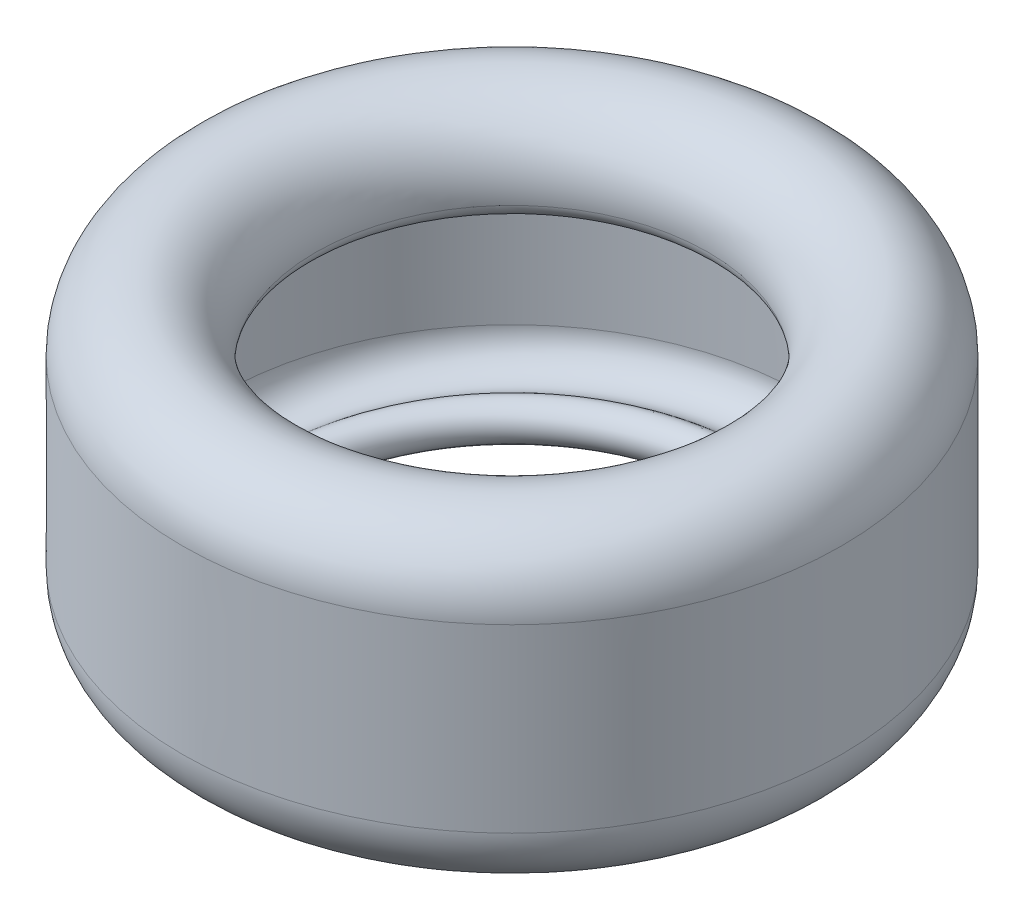
ISO-10303-21;
HEADER;
FILE_DESCRIPTION(('STEP AP214'),'2;1');
FILE_NAME('part.step','',(''),(''),'','','');
FILE_SCHEMA(('AUTOMOTIVE_DESIGN { 1 0 10303 214 1 1 1 1 }'));
ENDSEC;
DATA;
#1=APPLICATION_CONTEXT('core data for automotive mechanical design processes');
#2=APPLICATION_PROTOCOL_DEFINITION('international standard','automotive_design',2000,#1);
#3=PRODUCT_CONTEXT('',#1,'mechanical');
#4=PRODUCT('Part','Part','',(#3));
#5=PRODUCT_RELATED_PRODUCT_CATEGORY('part','',(#4));
#6=PRODUCT_DEFINITION_FORMATION('','',#4);
#7=PRODUCT_DEFINITION_CONTEXT('part definition',#1,'design');
#8=PRODUCT_DEFINITION('design','',#6,#7);
#9=PRODUCT_DEFINITION_SHAPE('','',#8);
#10=(LENGTH_UNIT() NAMED_UNIT(*) SI_UNIT(.MILLI.,.METRE.));
#11=(NAMED_UNIT(*) PLANE_ANGLE_UNIT() SI_UNIT($,.RADIAN.));
#12=(NAMED_UNIT(*) SI_UNIT($,.STERADIAN.) SOLID_ANGLE_UNIT());
#13=UNCERTAINTY_MEASURE_WITH_UNIT(LENGTH_MEASURE(1.E-05),#10,'distance_accuracy_value','');
#14=(GEOMETRIC_REPRESENTATION_CONTEXT(3) GLOBAL_UNCERTAINTY_ASSIGNED_CONTEXT((#13)) GLOBAL_UNIT_ASSIGNED_CONTEXT((#10,
#11,#12)) REPRESENTATION_CONTEXT('',''));
#15=CARTESIAN_POINT('',(0.,0.,0.));
#16=DIRECTION('',(0.,0.,1.));
#17=DIRECTION('',(1.,0.,0.));
#18=AXIS2_PLACEMENT_3D('',#15,#16,#17);
#19=CARTESIAN_POINT('',(-77.4132112010473,-7.67211809223587,-20.6484386701226));
#20=DIRECTION('',(0.,-1.,0.));
#21=DIRECTION('',(0.,0.,-1.));
#22=AXIS2_PLACEMENT_3D('',#19,#20,#21);
#23=TOROIDAL_SURFACE('',#22,7.27533232535165,0.850690122773279);
#24=CARTESIAN_POINT('',(-77.4132112010473,-7.67203104205877,-20.6484386701226));
#25=DIRECTION('',(0.,-1.,0.));
#26=DIRECTION('',(0.,0.,-1.));
#27=AXIS2_PLACEMENT_3D('',#24,#25,#26);
#28=CIRCLE('',#27,8.12602244367111);
#29=CARTESIAN_POINT('',(-77.4132112010473,-7.67203104205877,-28.7744611137937));
#30=VERTEX_POINT('',#29);
#31=EDGE_CURVE('E10',#30,#30,#28,.T.);
#32=ORIENTED_EDGE('',*,*,#31,.T.);
#33=EDGE_LOOP('',(#32));
#34=FACE_BOUND('',#33,.T.);
#35=CARTESIAN_POINT('',(-77.4132112010473,-7.78200104419663,-20.6484386701226));
#36=DIRECTION('',(0.,-1.,0.));
#37=DIRECTION('',(0.,0.,-1.));
#38=AXIS2_PLACEMENT_3D('',#35,#36,#37);
#39=CIRCLE('',#38,6.43176879967487);
#40=CARTESIAN_POINT('',(-77.4132112010473,-7.78200104419663,-27.0802074697975));
#41=VERTEX_POINT('',#40);
#42=EDGE_CURVE('E61',#41,#41,#39,.T.);
#43=ORIENTED_EDGE('',*,*,#42,.F.);
#44=EDGE_LOOP('',(#43));
#45=FACE_BOUND('',#44,.T.);
#46=ADVANCED_FACE('F33',(#34,#45),#23,.F.);
#47=CARTESIAN_POINT('',(-77.4132112010473,-7.67203104205877,-20.6484386701226));
#48=DIRECTION('',(0.,-1.,0.));
#49=DIRECTION('',(0.,0.,-1.));
#50=AXIS2_PLACEMENT_3D('',#47,#48,#49);
#51=CONICAL_SURFACE('',#50,8.12602244367111,0.000102328891464059);
#52=CARTESIAN_POINT('',(-77.4132112010473,-12.6720310158808,-20.6484386701226));
#53=DIRECTION('',(0.,-1.,0.));
#54=DIRECTION('',(0.,0.,-1.));
#55=AXIS2_PLACEMENT_3D('',#52,#53,#54);
#56=CIRCLE('',#55,8.12653408812754);
#57=CARTESIAN_POINT('',(-77.4132112010473,-12.6720310158808,-28.7749727582501));
#58=VERTEX_POINT('',#57);
#59=EDGE_CURVE('E39',#58,#58,#56,.T.);
#60=ORIENTED_EDGE('',*,*,#59,.T.);
#61=EDGE_LOOP('',(#60));
#62=FACE_BOUND('',#61,.T.);
#63=ORIENTED_EDGE('',*,*,#31,.F.);
#64=EDGE_LOOP('',(#63));
#65=FACE_BOUND('',#64,.T.);
#66=ADVANCED_FACE('F69',(#62,#65),#51,.F.);
#67=CARTESIAN_POINT('',(-77.4132112010473,-12.6721181184139,-20.6484386701226));
#68=DIRECTION('',(0.,-1.,0.));
#69=DIRECTION('',(0.,0.,-1.));
#70=AXIS2_PLACEMENT_3D('',#67,#68,#69);
#71=TOROIDAL_SURFACE('',#70,7.27533232535165,0.851201767232432);
#72=CARTESIAN_POINT('',(-77.4132112010473,-13.3049992446156,-20.6484386701226));
#73=DIRECTION('',(0.,-1.,0.));
#74=DIRECTION('',(0.,0.,-1.));
#75=AXIS2_PLACEMENT_3D('',#72,#73,#74);
#76=CIRCLE('',#75,6.70611713876816);
#77=CARTESIAN_POINT('',(-77.4132112010473,-13.3049992446156,-27.3545558088907));
#78=VERTEX_POINT('',#77);
#79=EDGE_CURVE('E43',#78,#78,#76,.T.);
#80=ORIENTED_EDGE('',*,*,#79,.T.);
#81=EDGE_LOOP('',(#80));
#82=FACE_BOUND('',#81,.T.);
#83=ORIENTED_EDGE('',*,*,#59,.F.);
#84=EDGE_LOOP('',(#83));
#85=FACE_BOUND('',#84,.T.);
#86=ADVANCED_FACE('F73',(#82,#85),#71,.F.);
#87=CARTESIAN_POINT('',(-77.4132112010473,-13.6767566531202,-20.6484386701226));
#88=DIRECTION('',(0.,-1.,0.));
#89=DIRECTION('',(0.,0.,-1.));
#90=AXIS2_PLACEMENT_3D('',#87,#88,#89);
#91=TOROIDAL_SURFACE('',#90,6.37175740850453,0.500000000000002);
#92=CARTESIAN_POINT('',(-77.4132112010473,-14.0485140616247,-20.6484386701226));
#93=DIRECTION('',(0.,-1.,0.));
#94=DIRECTION('',(0.,0.,-1.));
#95=AXIS2_PLACEMENT_3D('',#92,#93,#94);
#96=CIRCLE('',#95,6.03739767824093);
#97=CARTESIAN_POINT('',(-77.4132112010473,-14.0485140616247,-26.6858363483635));
#98=VERTEX_POINT('',#97);
#99=EDGE_CURVE('E47',#98,#98,#96,.T.);
#100=ORIENTED_EDGE('',*,*,#99,.T.);
#101=EDGE_LOOP('',(#100));
#102=FACE_BOUND('',#101,.T.);
#103=ORIENTED_EDGE('',*,*,#79,.F.);
#104=EDGE_LOOP('',(#103));
#105=FACE_BOUND('',#104,.T.);
#106=ADVANCED_FACE('F77',(#102,#105),#91,.T.);
#107=CARTESIAN_POINT('',(-77.4132112010473,-12.6721181184139,-20.6484386701226));
#108=DIRECTION('',(0.,-1.,0.));
#109=DIRECTION('',(0.,0.,-1.));
#110=AXIS2_PLACEMENT_3D('',#107,#108,#109);
#111=TOROIDAL_SURFACE('',#110,7.27533232535165,1.85120176723243);
#112=CARTESIAN_POINT('',(-77.4132112010473,-12.6719286869895,-20.6484386701226));
#113=DIRECTION('',(0.,-1.,0.));
#114=DIRECTION('',(0.,0.,-1.));
#115=AXIS2_PLACEMENT_3D('',#112,#113,#114);
#116=CIRCLE('',#115,9.12653408289193);
#117=CARTESIAN_POINT('',(-77.4132112010473,-12.6719286869895,-29.7749727530145));
#118=VERTEX_POINT('',#117);
#119=EDGE_CURVE('E52',#118,#118,#116,.T.);
#120=ORIENTED_EDGE('',*,*,#119,.T.);
#121=EDGE_LOOP('',(#120));
#122=FACE_BOUND('',#121,.T.);
#123=ORIENTED_EDGE('',*,*,#99,.F.);
#124=EDGE_LOOP('',(#123));
#125=FACE_BOUND('',#124,.T.);
#126=ADVANCED_FACE('F84',(#122,#125),#111,.T.);
#127=CARTESIAN_POINT('',(-77.4132112010473,-12.6719286869895,-20.6484386701226));
#128=DIRECTION('',(0.,-1.,0.));
#129=DIRECTION('',(0.,0.,-1.));
#130=AXIS2_PLACEMENT_3D('',#127,#128,#129);
#131=CONICAL_SURFACE('',#130,9.12653408289193,0.000102328891466141);
#132=CARTESIAN_POINT('',(-77.4132112010473,-7.67192871316747,-20.6484386701226));
#133=DIRECTION('',(0.,-1.,0.));
#134=DIRECTION('',(0.,0.,-1.));
#135=AXIS2_PLACEMENT_3D('',#132,#133,#134);
#136=CIRCLE('',#135,9.12602243843549);
#137=CARTESIAN_POINT('',(-77.4132112010473,-7.67192871316747,-29.7744611085581));
#138=VERTEX_POINT('',#137);
#139=EDGE_CURVE('E55',#138,#138,#136,.T.);
#140=ORIENTED_EDGE('',*,*,#139,.T.);
#141=EDGE_LOOP('',(#140));
#142=FACE_BOUND('',#141,.T.);
#143=ORIENTED_EDGE('',*,*,#119,.F.);
#144=EDGE_LOOP('',(#143));
#145=FACE_BOUND('',#144,.T.);
#146=ADVANCED_FACE('F88',(#142,#145),#131,.T.);
#147=CARTESIAN_POINT('',(-77.4132112010473,-7.67211809223587,-20.6484386701226));
#148=DIRECTION('',(0.,-1.,0.));
#149=DIRECTION('',(0.,0.,-1.));
#150=AXIS2_PLACEMENT_3D('',#147,#148,#149);
#151=TOROIDAL_SURFACE('',#150,7.27533232535165,1.85069012277332);
#152=CARTESIAN_POINT('',(-77.4132112010473,-7.91117023168238,-20.6484386701226));
#153=DIRECTION('',(0.,-1.,0.));
#154=DIRECTION('',(0.,0.,-1.));
#155=AXIS2_PLACEMENT_3D('',#152,#153,#154);
#156=CIRCLE('',#155,5.44014622984069);
#157=CARTESIAN_POINT('',(-77.4132112010473,-7.91117023168238,-26.0885848999633));
#158=VERTEX_POINT('',#157);
#159=EDGE_CURVE('E58',#158,#158,#156,.T.);
#160=ORIENTED_EDGE('',*,*,#159,.T.);
#161=EDGE_LOOP('',(#160));
#162=FACE_BOUND('',#161,.T.);
#163=ORIENTED_EDGE('',*,*,#139,.F.);
#164=EDGE_LOOP('',(#163));
#165=FACE_BOUND('',#164,.T.);
#166=ADVANCED_FACE('F92',(#162,#165),#151,.T.);
#167=CARTESIAN_POINT('',(-77.4132112010473,-7.84658563793952,-20.6484386701226));
#168=DIRECTION('',(0.,-1.,0.));
#169=DIRECTION('',(0.,0.,-1.));
#170=AXIS2_PLACEMENT_3D('',#167,#168,#169);
#171=TOROIDAL_SURFACE('',#170,5.9359575147578,0.500000000000048);
#172=ORIENTED_EDGE('',*,*,#42,.T.);
#173=EDGE_LOOP('',(#172));
#174=FACE_BOUND('',#173,.T.);
#175=ORIENTED_EDGE('',*,*,#159,.F.);
#176=EDGE_LOOP('',(#175));
#177=FACE_BOUND('',#176,.T.);
#178=ADVANCED_FACE('F65',(#174,#177),#171,.T.);
#179=CLOSED_SHELL('',(#46,#66,#86,#106,#126,#146,#166,#178));
#180=MANIFOLD_SOLID_BREP('B2',#179);
#181=ADVANCED_BREP_SHAPE_REPRESENTATION('',(#18,#180),#14);
#182=SHAPE_DEFINITION_REPRESENTATION(#9,#181);
ENDSEC;
END-ISO-10303-21;
